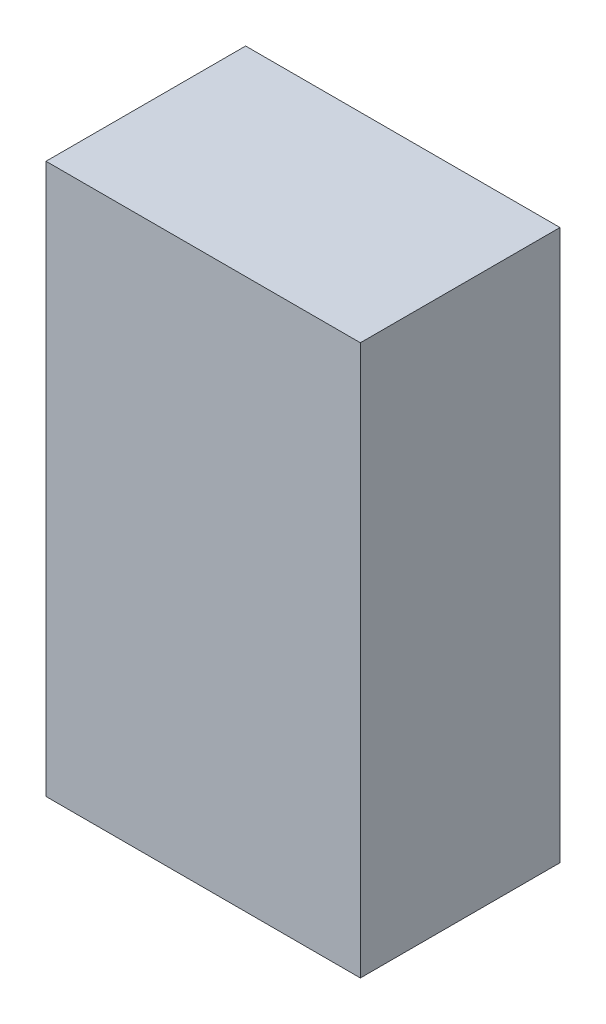
ISO-10303-21;
HEADER;
FILE_DESCRIPTION(('STEP AP214'),'2;1');
FILE_NAME('part.step','',(''),(''),'','','');
FILE_SCHEMA(('AUTOMOTIVE_DESIGN { 1 0 10303 214 1 1 1 1 }'));
ENDSEC;
DATA;
#1=APPLICATION_CONTEXT('core data for automotive mechanical design processes');
#2=APPLICATION_PROTOCOL_DEFINITION('international standard','automotive_design',2000,#1);
#3=PRODUCT_CONTEXT('',#1,'mechanical');
#4=PRODUCT('Part','Part','',(#3));
#5=PRODUCT_RELATED_PRODUCT_CATEGORY('part','',(#4));
#6=PRODUCT_DEFINITION_FORMATION('','',#4);
#7=PRODUCT_DEFINITION_CONTEXT('part definition',#1,'design');
#8=PRODUCT_DEFINITION('design','',#6,#7);
#9=PRODUCT_DEFINITION_SHAPE('','',#8);
#10=(LENGTH_UNIT() NAMED_UNIT(*) SI_UNIT(.MILLI.,.METRE.));
#11=(NAMED_UNIT(*) PLANE_ANGLE_UNIT() SI_UNIT($,.RADIAN.));
#12=(NAMED_UNIT(*) SI_UNIT($,.STERADIAN.) SOLID_ANGLE_UNIT());
#13=UNCERTAINTY_MEASURE_WITH_UNIT(LENGTH_MEASURE(1.E-05),#10,'distance_accuracy_value','');
#14=(GEOMETRIC_REPRESENTATION_CONTEXT(3) GLOBAL_UNCERTAINTY_ASSIGNED_CONTEXT((#13)) GLOBAL_UNIT_ASSIGNED_CONTEXT((#10,
#11,#12)) REPRESENTATION_CONTEXT('',''));
#15=CARTESIAN_POINT('',(0.,0.,0.));
#16=DIRECTION('',(0.,0.,1.));
#17=DIRECTION('',(1.,0.,0.));
#18=AXIS2_PLACEMENT_3D('',#15,#16,#17);
#19=CARTESIAN_POINT('',(0.,0.,12.7));
#20=DIRECTION('',(1.,0.,0.));
#21=DIRECTION('',(0.,0.,-1.));
#22=AXIS2_PLACEMENT_3D('',#19,#20,#21);
#23=PLANE('',#22);
#24=DIRECTION('',(0.,-1.,0.));
#25=VECTOR('',#24,1.);
#26=CARTESIAN_POINT('',(0.,0.,0.));
#27=LINE('',#26,#25);
#28=CARTESIAN_POINT('',(0.,0.,0.));
#29=VERTEX_POINT('',#28);
#30=CARTESIAN_POINT('',(0.,-35.,0.));
#31=VERTEX_POINT('',#30);
#32=EDGE_CURVE('E96',#29,#31,#27,.T.);
#33=ORIENTED_EDGE('',*,*,#32,.T.);
#34=DIRECTION('',(0.,0.,-1.));
#35=VECTOR('',#34,1.);
#36=CARTESIAN_POINT('',(0.,-35.,12.7));
#37=LINE('',#36,#35);
#38=CARTESIAN_POINT('',(0.,-35.,12.7));
#39=VERTEX_POINT('',#38);
#40=EDGE_CURVE('E11',#39,#31,#37,.T.);
#41=ORIENTED_EDGE('',*,*,#40,.F.);
#42=DIRECTION('',(0.,-1.,0.));
#43=VECTOR('',#42,1.);
#44=CARTESIAN_POINT('',(0.,0.,12.7));
#45=LINE('',#44,#43);
#46=CARTESIAN_POINT('',(0.,0.,12.7));
#47=VERTEX_POINT('',#46);
#48=EDGE_CURVE('E84',#47,#39,#45,.T.);
#49=ORIENTED_EDGE('',*,*,#48,.F.);
#50=DIRECTION('',(0.,0.,-1.));
#51=VECTOR('',#50,1.);
#52=CARTESIAN_POINT('',(0.,0.,12.7));
#53=LINE('',#52,#51);
#54=EDGE_CURVE('E92',#47,#29,#53,.T.);
#55=ORIENTED_EDGE('',*,*,#54,.T.);
#56=EDGE_LOOP('',(#33,#41,#49,#55));
#57=FACE_BOUND('',#56,.T.);
#58=ADVANCED_FACE('F33',(#57),#23,.F.);
#59=CARTESIAN_POINT('',(0.,-35.,12.7));
#60=DIRECTION('',(0.,1.,0.));
#61=DIRECTION('',(0.,0.,1.));
#62=AXIS2_PLACEMENT_3D('',#59,#60,#61);
#63=PLANE('',#62);
#64=DIRECTION('',(1.,0.,0.));
#65=VECTOR('',#64,1.);
#66=CARTESIAN_POINT('',(0.,-35.,0.));
#67=LINE('',#66,#65);
#68=CARTESIAN_POINT('',(20.,-35.,0.));
#69=VERTEX_POINT('',#68);
#70=EDGE_CURVE('E88',#31,#69,#67,.T.);
#71=ORIENTED_EDGE('',*,*,#70,.T.);
#72=DIRECTION('',(0.,0.,-1.));
#73=VECTOR('',#72,1.);
#74=CARTESIAN_POINT('',(20.,-35.,12.7));
#75=LINE('',#74,#73);
#76=CARTESIAN_POINT('',(20.,-35.,12.7));
#77=VERTEX_POINT('',#76);
#78=EDGE_CURVE('E41',#77,#69,#75,.T.);
#79=ORIENTED_EDGE('',*,*,#78,.F.);
#80=DIRECTION('',(1.,0.,0.));
#81=VECTOR('',#80,1.);
#82=CARTESIAN_POINT('',(0.,-35.,12.7));
#83=LINE('',#82,#81);
#84=EDGE_CURVE('E79',#39,#77,#83,.T.);
#85=ORIENTED_EDGE('',*,*,#84,.F.);
#86=ORIENTED_EDGE('',*,*,#40,.T.);
#87=EDGE_LOOP('',(#71,#79,#85,#86));
#88=FACE_BOUND('',#87,.T.);
#89=ADVANCED_FACE('F87',(#88),#63,.F.);
#90=CARTESIAN_POINT('',(20.,0.,12.7));
#91=DIRECTION('',(-1.,0.,0.));
#92=DIRECTION('',(0.,0.,1.));
#93=AXIS2_PLACEMENT_3D('',#90,#91,#92);
#94=PLANE('',#93);
#95=DIRECTION('',(0.,1.,0.));
#96=VECTOR('',#95,1.);
#97=CARTESIAN_POINT('',(20.,0.,0.));
#98=LINE('',#97,#96);
#99=CARTESIAN_POINT('',(20.,0.,0.));
#100=VERTEX_POINT('',#99);
#101=EDGE_CURVE('E66',#69,#100,#98,.T.);
#102=ORIENTED_EDGE('',*,*,#101,.T.);
#103=DIRECTION('',(0.,0.,-1.));
#104=VECTOR('',#103,1.);
#105=CARTESIAN_POINT('',(20.,0.,12.7));
#106=LINE('',#105,#104);
#107=CARTESIAN_POINT('',(20.,0.,12.7));
#108=VERTEX_POINT('',#107);
#109=EDGE_CURVE('E89',#108,#100,#106,.T.);
#110=ORIENTED_EDGE('',*,*,#109,.F.);
#111=DIRECTION('',(0.,1.,0.));
#112=VECTOR('',#111,1.);
#113=CARTESIAN_POINT('',(20.,0.,12.7));
#114=LINE('',#113,#112);
#115=EDGE_CURVE('E82',#77,#108,#114,.T.);
#116=ORIENTED_EDGE('',*,*,#115,.F.);
#117=ORIENTED_EDGE('',*,*,#78,.T.);
#118=EDGE_LOOP('',(#102,#110,#116,#117));
#119=FACE_BOUND('',#118,.T.);
#120=ADVANCED_FACE('F90',(#119),#94,.F.);
#121=CARTESIAN_POINT('',(0.,0.,12.7));
#122=DIRECTION('',(0.,-1.,0.));
#123=DIRECTION('',(0.,0.,-1.));
#124=AXIS2_PLACEMENT_3D('',#121,#122,#123);
#125=PLANE('',#124);
#126=DIRECTION('',(-1.,0.,0.));
#127=VECTOR('',#126,1.);
#128=CARTESIAN_POINT('',(0.,0.,0.));
#129=LINE('',#128,#127);
#130=EDGE_CURVE('E72',#100,#29,#129,.T.);
#131=ORIENTED_EDGE('',*,*,#130,.T.);
#132=ORIENTED_EDGE('',*,*,#54,.F.);
#133=DIRECTION('',(-1.,0.,0.));
#134=VECTOR('',#133,1.);
#135=CARTESIAN_POINT('',(0.,0.,12.7));
#136=LINE('',#135,#134);
#137=EDGE_CURVE('E49',#108,#47,#136,.T.);
#138=ORIENTED_EDGE('',*,*,#137,.F.);
#139=ORIENTED_EDGE('',*,*,#109,.T.);
#140=EDGE_LOOP('',(#131,#132,#138,#139));
#141=FACE_BOUND('',#140,.T.);
#142=ADVANCED_FACE('F103',(#141),#125,.F.);
#143=CARTESIAN_POINT('',(0.,0.,12.7));
#144=DIRECTION('',(0.,0.,1.));
#145=DIRECTION('',(1.,0.,0.));
#146=AXIS2_PLACEMENT_3D('',#143,#144,#145);
#147=PLANE('',#146);
#148=ORIENTED_EDGE('',*,*,#48,.T.);
#149=ORIENTED_EDGE('',*,*,#84,.T.);
#150=ORIENTED_EDGE('',*,*,#115,.T.);
#151=ORIENTED_EDGE('',*,*,#137,.T.);
#152=EDGE_LOOP('',(#148,#149,#150,#151));
#153=FACE_BOUND('',#152,.T.);
#154=ADVANCED_FACE('F80',(#153),#147,.T.);
#155=CARTESIAN_POINT('',(0.,0.,0.));
#156=DIRECTION('',(0.,0.,1.));
#157=DIRECTION('',(1.,0.,0.));
#158=AXIS2_PLACEMENT_3D('',#155,#156,#157);
#159=PLANE('',#158);
#160=ORIENTED_EDGE('',*,*,#32,.F.);
#161=ORIENTED_EDGE('',*,*,#130,.F.);
#162=ORIENTED_EDGE('',*,*,#101,.F.);
#163=ORIENTED_EDGE('',*,*,#70,.F.);
#164=EDGE_LOOP('',(#160,#161,#162,#163));
#165=FACE_BOUND('',#164,.T.);
#166=ADVANCED_FACE('F106',(#165),#159,.F.);
#167=CLOSED_SHELL('',(#58,#89,#120,#142,#154,#166));
#168=MANIFOLD_SOLID_BREP('B2',#167);
#169=ADVANCED_BREP_SHAPE_REPRESENTATION('',(#18,#168),#14);
#170=SHAPE_DEFINITION_REPRESENTATION(#9,#169);
ENDSEC;
END-ISO-10303-21;
